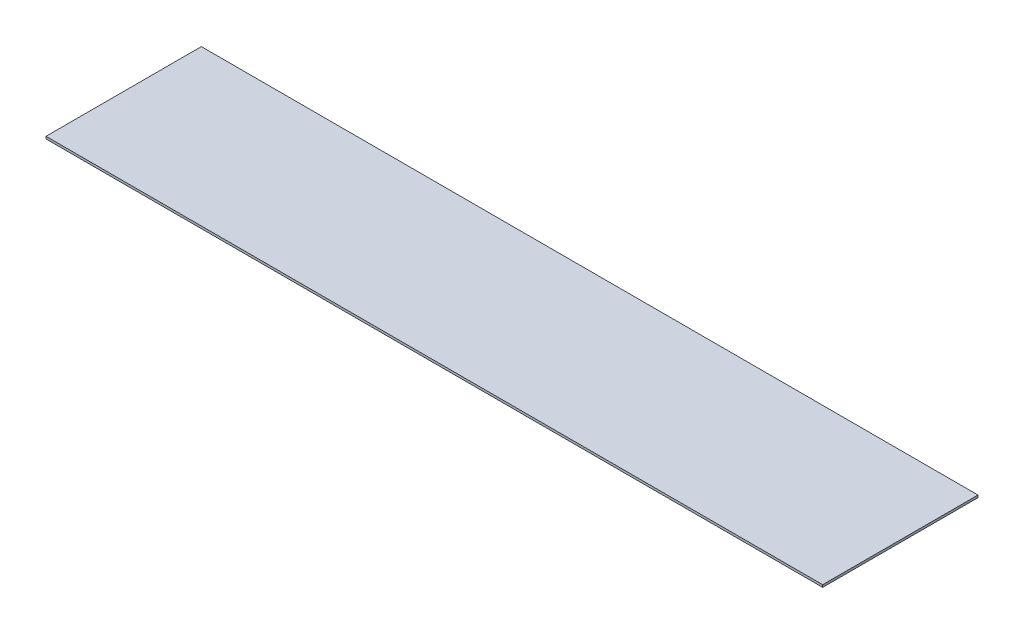
ISO-10303-21;
HEADER;
FILE_DESCRIPTION(('STEP AP214'),'2;1');
FILE_NAME('part.step','',(''),(''),'','','');
FILE_SCHEMA(('AUTOMOTIVE_DESIGN { 1 0 10303 214 1 1 1 1 }'));
ENDSEC;
DATA;
#1=APPLICATION_CONTEXT('core data for automotive mechanical design processes');
#2=APPLICATION_PROTOCOL_DEFINITION('international standard','automotive_design',2000,#1);
#3=PRODUCT_CONTEXT('',#1,'mechanical');
#4=PRODUCT('Part','Part','',(#3));
#5=PRODUCT_RELATED_PRODUCT_CATEGORY('part','',(#4));
#6=PRODUCT_DEFINITION_FORMATION('','',#4);
#7=PRODUCT_DEFINITION_CONTEXT('part definition',#1,'design');
#8=PRODUCT_DEFINITION('design','',#6,#7);
#9=PRODUCT_DEFINITION_SHAPE('','',#8);
#10=(LENGTH_UNIT() NAMED_UNIT(*) SI_UNIT(.MILLI.,.METRE.));
#11=(NAMED_UNIT(*) PLANE_ANGLE_UNIT() SI_UNIT($,.RADIAN.));
#12=(NAMED_UNIT(*) SI_UNIT($,.STERADIAN.) SOLID_ANGLE_UNIT());
#13=UNCERTAINTY_MEASURE_WITH_UNIT(LENGTH_MEASURE(1.E-05),#10,'distance_accuracy_value','');
#14=(GEOMETRIC_REPRESENTATION_CONTEXT(3) GLOBAL_UNCERTAINTY_ASSIGNED_CONTEXT((#13)) GLOBAL_UNIT_ASSIGNED_CONTEXT((#10,
#11,#12)) REPRESENTATION_CONTEXT('',''));
#15=CARTESIAN_POINT('',(0.,0.,0.));
#16=DIRECTION('',(0.,0.,1.));
#17=DIRECTION('',(1.,0.,0.));
#18=AXIS2_PLACEMENT_3D('',#15,#16,#17);
#19=CARTESIAN_POINT('',(500.,3.,-100.));
#20=DIRECTION('',(-1.,0.,0.));
#21=DIRECTION('',(0.,0.,1.));
#22=AXIS2_PLACEMENT_3D('',#19,#20,#21);
#23=PLANE('',#22);
#24=DIRECTION('',(0.,0.,-1.));
#25=VECTOR('',#24,1.);
#26=CARTESIAN_POINT('',(500.,0.,-100.));
#27=LINE('',#26,#25);
#28=CARTESIAN_POINT('',(500.,0.,100.));
#29=VERTEX_POINT('',#28);
#30=CARTESIAN_POINT('',(500.,0.,-100.));
#31=VERTEX_POINT('',#30);
#32=EDGE_CURVE('E102',#29,#31,#27,.T.);
#33=ORIENTED_EDGE('',*,*,#32,.T.);
#34=DIRECTION('',(0.,-1.,0.));
#35=VECTOR('',#34,1.);
#36=CARTESIAN_POINT('',(500.,3.,-100.));
#37=LINE('',#36,#35);
#38=CARTESIAN_POINT('',(500.,3.,-100.));
#39=VERTEX_POINT('',#38);
#40=EDGE_CURVE('E11',#39,#31,#37,.T.);
#41=ORIENTED_EDGE('',*,*,#40,.F.);
#42=DIRECTION('',(0.,0.,-1.));
#43=VECTOR('',#42,1.);
#44=CARTESIAN_POINT('',(500.,3.,-100.));
#45=LINE('',#44,#43);
#46=CARTESIAN_POINT('',(500.,3.,100.));
#47=VERTEX_POINT('',#46);
#48=EDGE_CURVE('E90',#47,#39,#45,.T.);
#49=ORIENTED_EDGE('',*,*,#48,.F.);
#50=DIRECTION('',(0.,-1.,0.));
#51=VECTOR('',#50,1.);
#52=CARTESIAN_POINT('',(500.,3.,100.));
#53=LINE('',#52,#51);
#54=EDGE_CURVE('E98',#47,#29,#53,.T.);
#55=ORIENTED_EDGE('',*,*,#54,.T.);
#56=EDGE_LOOP('',(#33,#41,#49,#55));
#57=FACE_BOUND('',#56,.T.);
#58=ADVANCED_FACE('F39',(#57),#23,.F.);
#59=CARTESIAN_POINT('',(-500.,3.,-100.));
#60=DIRECTION('',(0.,0.,1.));
#61=DIRECTION('',(1.,0.,0.));
#62=AXIS2_PLACEMENT_3D('',#59,#60,#61);
#63=PLANE('',#62);
#64=DIRECTION('',(-1.,0.,0.));
#65=VECTOR('',#64,1.);
#66=CARTESIAN_POINT('',(-500.,0.,-100.));
#67=LINE('',#66,#65);
#68=CARTESIAN_POINT('',(-500.,0.,-100.));
#69=VERTEX_POINT('',#68);
#70=EDGE_CURVE('E94',#31,#69,#67,.T.);
#71=ORIENTED_EDGE('',*,*,#70,.T.);
#72=DIRECTION('',(0.,-1.,0.));
#73=VECTOR('',#72,1.);
#74=CARTESIAN_POINT('',(-500.,3.,-100.));
#75=LINE('',#74,#73);
#76=CARTESIAN_POINT('',(-500.,3.,-100.));
#77=VERTEX_POINT('',#76);
#78=EDGE_CURVE('E47',#77,#69,#75,.T.);
#79=ORIENTED_EDGE('',*,*,#78,.F.);
#80=DIRECTION('',(-1.,0.,0.));
#81=VECTOR('',#80,1.);
#82=CARTESIAN_POINT('',(-500.,3.,-100.));
#83=LINE('',#82,#81);
#84=EDGE_CURVE('E85',#39,#77,#83,.T.);
#85=ORIENTED_EDGE('',*,*,#84,.F.);
#86=ORIENTED_EDGE('',*,*,#40,.T.);
#87=EDGE_LOOP('',(#71,#79,#85,#86));
#88=FACE_BOUND('',#87,.T.);
#89=ADVANCED_FACE('F93',(#88),#63,.F.);
#90=CARTESIAN_POINT('',(-500.,3.,-100.));
#91=DIRECTION('',(1.,0.,0.));
#92=DIRECTION('',(0.,0.,-1.));
#93=AXIS2_PLACEMENT_3D('',#90,#91,#92);
#94=PLANE('',#93);
#95=DIRECTION('',(0.,0.,1.));
#96=VECTOR('',#95,1.);
#97=CARTESIAN_POINT('',(-500.,0.,-100.));
#98=LINE('',#97,#96);
#99=CARTESIAN_POINT('',(-500.,0.,100.));
#100=VERTEX_POINT('',#99);
#101=EDGE_CURVE('E72',#69,#100,#98,.T.);
#102=ORIENTED_EDGE('',*,*,#101,.T.);
#103=DIRECTION('',(0.,-1.,0.));
#104=VECTOR('',#103,1.);
#105=CARTESIAN_POINT('',(-500.,3.,100.));
#106=LINE('',#105,#104);
#107=CARTESIAN_POINT('',(-500.,3.,100.));
#108=VERTEX_POINT('',#107);
#109=EDGE_CURVE('E95',#108,#100,#106,.T.);
#110=ORIENTED_EDGE('',*,*,#109,.F.);
#111=DIRECTION('',(0.,0.,1.));
#112=VECTOR('',#111,1.);
#113=CARTESIAN_POINT('',(-500.,3.,-100.));
#114=LINE('',#113,#112);
#115=EDGE_CURVE('E88',#77,#108,#114,.T.);
#116=ORIENTED_EDGE('',*,*,#115,.F.);
#117=ORIENTED_EDGE('',*,*,#78,.T.);
#118=EDGE_LOOP('',(#102,#110,#116,#117));
#119=FACE_BOUND('',#118,.T.);
#120=ADVANCED_FACE('F96',(#119),#94,.F.);
#121=CARTESIAN_POINT('',(-500.,3.,100.));
#122=DIRECTION('',(0.,0.,-1.));
#123=DIRECTION('',(-1.,0.,0.));
#124=AXIS2_PLACEMENT_3D('',#121,#122,#123);
#125=PLANE('',#124);
#126=DIRECTION('',(1.,0.,0.));
#127=VECTOR('',#126,1.);
#128=CARTESIAN_POINT('',(-500.,0.,100.));
#129=LINE('',#128,#127);
#130=EDGE_CURVE('E78',#100,#29,#129,.T.);
#131=ORIENTED_EDGE('',*,*,#130,.T.);
#132=ORIENTED_EDGE('',*,*,#54,.F.);
#133=DIRECTION('',(1.,0.,0.));
#134=VECTOR('',#133,1.);
#135=CARTESIAN_POINT('',(-500.,3.,100.));
#136=LINE('',#135,#134);
#137=EDGE_CURVE('E55',#108,#47,#136,.T.);
#138=ORIENTED_EDGE('',*,*,#137,.F.);
#139=ORIENTED_EDGE('',*,*,#109,.T.);
#140=EDGE_LOOP('',(#131,#132,#138,#139));
#141=FACE_BOUND('',#140,.T.);
#142=ADVANCED_FACE('F109',(#141),#125,.F.);
#143=CARTESIAN_POINT('',(500.,3.,100.));
#144=DIRECTION('',(0.,1.,0.));
#145=DIRECTION('',(0.,0.,1.));
#146=AXIS2_PLACEMENT_3D('',#143,#144,#145);
#147=PLANE('',#146);
#148=ORIENTED_EDGE('',*,*,#48,.T.);
#149=ORIENTED_EDGE('',*,*,#84,.T.);
#150=ORIENTED_EDGE('',*,*,#115,.T.);
#151=ORIENTED_EDGE('',*,*,#137,.T.);
#152=EDGE_LOOP('',(#148,#149,#150,#151));
#153=FACE_BOUND('',#152,.T.);
#154=ADVANCED_FACE('F86',(#153),#147,.T.);
#155=CARTESIAN_POINT('',(500.,0.,100.));
#156=DIRECTION('',(0.,1.,0.));
#157=DIRECTION('',(0.,0.,1.));
#158=AXIS2_PLACEMENT_3D('',#155,#156,#157);
#159=PLANE('',#158);
#160=ORIENTED_EDGE('',*,*,#32,.F.);
#161=ORIENTED_EDGE('',*,*,#130,.F.);
#162=ORIENTED_EDGE('',*,*,#101,.F.);
#163=ORIENTED_EDGE('',*,*,#70,.F.);
#164=EDGE_LOOP('',(#160,#161,#162,#163));
#165=FACE_BOUND('',#164,.T.);
#166=ADVANCED_FACE('F112',(#165),#159,.F.);
#167=CLOSED_SHELL('',(#58,#89,#120,#142,#154,#166));
#168=MANIFOLD_SOLID_BREP('B2',#167);
#169=ADVANCED_BREP_SHAPE_REPRESENTATION('',(#18,#168),#14);
#170=SHAPE_DEFINITION_REPRESENTATION(#9,#169);
ENDSEC;
END-ISO-10303-21;
